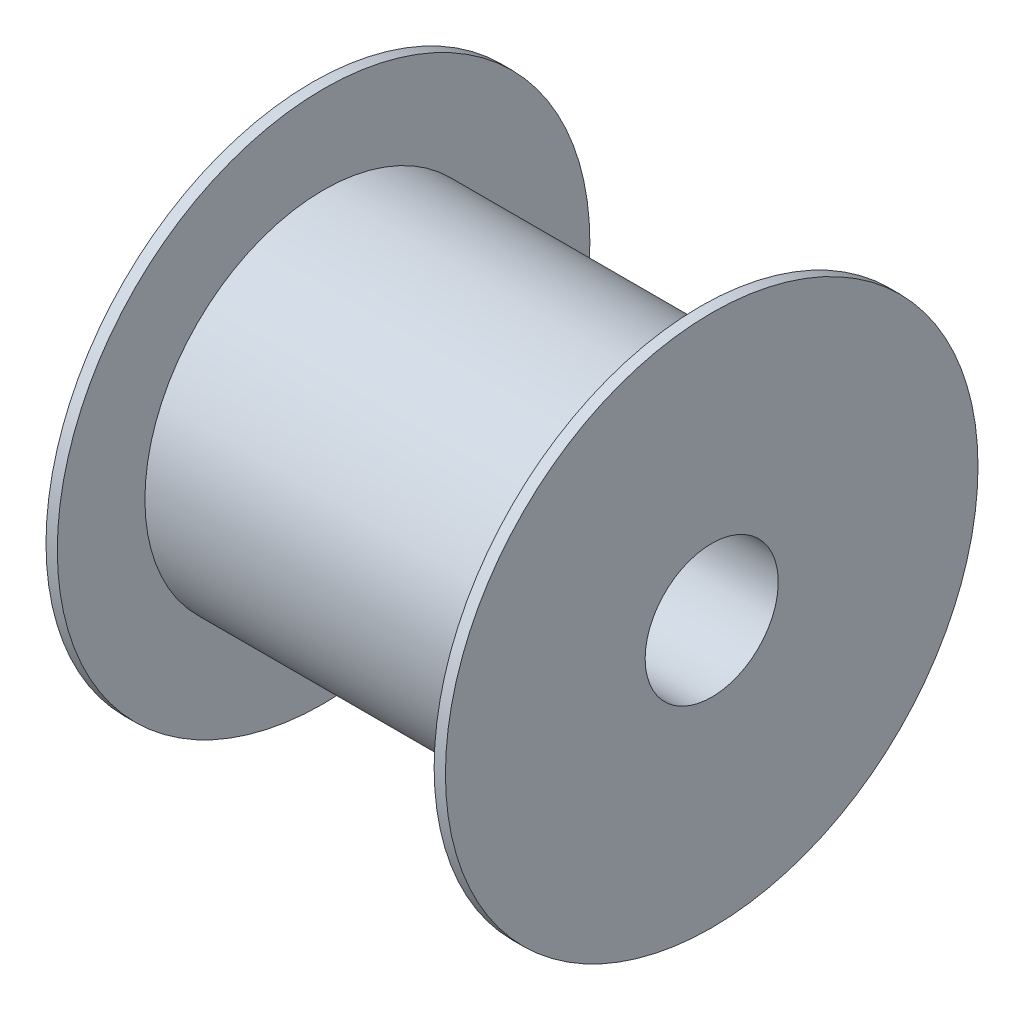
ISO-10303-21;
HEADER;
FILE_DESCRIPTION(('STEP AP214'),'2;1');
FILE_NAME('part.step','',(''),(''),'','','');
FILE_SCHEMA(('AUTOMOTIVE_DESIGN { 1 0 10303 214 1 1 1 1 }'));
ENDSEC;
DATA;
#1=APPLICATION_CONTEXT('core data for automotive mechanical design processes');
#2=APPLICATION_PROTOCOL_DEFINITION('international standard','automotive_design',2000,#1);
#3=PRODUCT_CONTEXT('',#1,'mechanical');
#4=PRODUCT('Part','Part','',(#3));
#5=PRODUCT_RELATED_PRODUCT_CATEGORY('part','',(#4));
#6=PRODUCT_DEFINITION_FORMATION('','',#4);
#7=PRODUCT_DEFINITION_CONTEXT('part definition',#1,'design');
#8=PRODUCT_DEFINITION('design','',#6,#7);
#9=PRODUCT_DEFINITION_SHAPE('','',#8);
#10=(LENGTH_UNIT() NAMED_UNIT(*) SI_UNIT(.MILLI.,.METRE.));
#11=(NAMED_UNIT(*) PLANE_ANGLE_UNIT() SI_UNIT($,.RADIAN.));
#12=(NAMED_UNIT(*) SI_UNIT($,.STERADIAN.) SOLID_ANGLE_UNIT());
#13=UNCERTAINTY_MEASURE_WITH_UNIT(LENGTH_MEASURE(1.E-05),#10,'distance_accuracy_value','');
#14=(GEOMETRIC_REPRESENTATION_CONTEXT(3) GLOBAL_UNCERTAINTY_ASSIGNED_CONTEXT((#13)) GLOBAL_UNIT_ASSIGNED_CONTEXT((#10,
#11,#12)) REPRESENTATION_CONTEXT('',''));
#15=CARTESIAN_POINT('',(0.,0.,0.));
#16=DIRECTION('',(0.,0.,1.));
#17=DIRECTION('',(1.,0.,0.));
#18=AXIS2_PLACEMENT_3D('',#15,#16,#17);
#19=CARTESIAN_POINT('',(28.3028720626632,40.,0.));
#20=DIRECTION('',(1.,0.,0.));
#21=DIRECTION('',(0.,0.,-1.));
#22=AXIS2_PLACEMENT_3D('',#19,#20,#21);
#23=PLANE('',#22);
#24=CARTESIAN_POINT('',(28.3028720626632,0.,0.));
#25=DIRECTION('',(-1.,0.,0.));
#26=DIRECTION('',(0.,0.,1.));
#27=AXIS2_PLACEMENT_3D('',#24,#25,#26);
#28=CIRCLE('',#27,26.8407310704961);
#29=CARTESIAN_POINT('',(28.3028720626632,0.,26.8407310704961));
#30=VERTEX_POINT('',#29);
#31=EDGE_CURVE('E72',#30,#30,#28,.T.);
#32=ORIENTED_EDGE('',*,*,#31,.F.);
#33=EDGE_LOOP('',(#32));
#34=FACE_BOUND('',#33,.T.);
#35=CARTESIAN_POINT('',(28.3028720626632,0.,0.));
#36=DIRECTION('',(-1.,0.,0.));
#37=DIRECTION('',(0.,0.,1.));
#38=AXIS2_PLACEMENT_3D('',#35,#36,#37);
#39=CIRCLE('',#38,40.);
#40=CARTESIAN_POINT('',(28.3028720626632,0.,40.));
#41=VERTEX_POINT('',#40);
#42=EDGE_CURVE('E10',#41,#41,#39,.T.);
#43=ORIENTED_EDGE('',*,*,#42,.T.);
#44=EDGE_LOOP('',(#43));
#45=FACE_BOUND('',#44,.T.);
#46=ADVANCED_FACE('F37',(#34,#45),#23,.F.);
#47=CARTESIAN_POINT('',(0.,0.,0.));
#48=DIRECTION('',(-1.,0.,0.));
#49=DIRECTION('',(0.,0.,1.));
#50=AXIS2_PLACEMENT_3D('',#47,#48,#49);
#51=CYLINDRICAL_SURFACE('',#50,40.);
#52=ORIENTED_EDGE('',*,*,#42,.F.);
#53=EDGE_LOOP('',(#52));
#54=FACE_BOUND('',#53,.T.);
#55=CARTESIAN_POINT('',(30.,0.,0.));
#56=DIRECTION('',(-1.,0.,0.));
#57=DIRECTION('',(0.,0.,1.));
#58=AXIS2_PLACEMENT_3D('',#55,#56,#57);
#59=CIRCLE('',#58,40.);
#60=CARTESIAN_POINT('',(30.,0.,40.));
#61=VERTEX_POINT('',#60);
#62=EDGE_CURVE('E44',#61,#61,#59,.T.);
#63=ORIENTED_EDGE('',*,*,#62,.T.);
#64=EDGE_LOOP('',(#63));
#65=FACE_BOUND('',#64,.T.);
#66=ADVANCED_FACE('F80',(#54,#65),#51,.T.);
#67=CARTESIAN_POINT('',(30.,10.,0.));
#68=DIRECTION('',(-1.,0.,0.));
#69=DIRECTION('',(0.,0.,1.));
#70=AXIS2_PLACEMENT_3D('',#67,#68,#69);
#71=PLANE('',#70);
#72=ORIENTED_EDGE('',*,*,#62,.F.);
#73=EDGE_LOOP('',(#72));
#74=FACE_BOUND('',#73,.T.);
#75=CARTESIAN_POINT('',(30.,0.,0.));
#76=DIRECTION('',(-1.,0.,0.));
#77=DIRECTION('',(0.,0.,1.));
#78=AXIS2_PLACEMENT_3D('',#75,#76,#77);
#79=CIRCLE('',#78,10.);
#80=CARTESIAN_POINT('',(30.,0.,10.));
#81=VERTEX_POINT('',#80);
#82=EDGE_CURVE('E49',#81,#81,#79,.T.);
#83=ORIENTED_EDGE('',*,*,#82,.T.);
#84=EDGE_LOOP('',(#83));
#85=FACE_BOUND('',#84,.T.);
#86=ADVANCED_FACE('F84',(#74,#85),#71,.F.);
#87=CARTESIAN_POINT('',(0.,0.,0.));
#88=DIRECTION('',(-1.,0.,0.));
#89=DIRECTION('',(0.,0.,1.));
#90=AXIS2_PLACEMENT_3D('',#87,#88,#89);
#91=CYLINDRICAL_SURFACE('',#90,10.);
#92=ORIENTED_EDGE('',*,*,#82,.F.);
#93=EDGE_LOOP('',(#92));
#94=FACE_BOUND('',#93,.T.);
#95=CARTESIAN_POINT('',(-30.,0.,0.));
#96=DIRECTION('',(-1.,0.,0.));
#97=DIRECTION('',(0.,0.,1.));
#98=AXIS2_PLACEMENT_3D('',#95,#96,#97);
#99=CIRCLE('',#98,9.99999999999999);
#100=CARTESIAN_POINT('',(-30.,0.,9.99999999999999));
#101=VERTEX_POINT('',#100);
#102=EDGE_CURVE('E54',#101,#101,#99,.T.);
#103=ORIENTED_EDGE('',*,*,#102,.T.);
#104=EDGE_LOOP('',(#103));
#105=FACE_BOUND('',#104,.T.);
#106=ADVANCED_FACE('F89',(#94,#105),#91,.F.);
#107=CARTESIAN_POINT('',(-30.,9.99999999999999,0.));
#108=DIRECTION('',(-1.,0.,0.));
#109=DIRECTION('',(0.,0.,1.));
#110=AXIS2_PLACEMENT_3D('',#107,#108,#109);
#111=PLANE('',#110);
#112=CARTESIAN_POINT('',(-30.,0.,0.));
#113=DIRECTION('',(-1.,0.,0.));
#114=DIRECTION('',(0.,0.,1.));
#115=AXIS2_PLACEMENT_3D('',#112,#113,#114);
#116=CIRCLE('',#115,40.);
#117=CARTESIAN_POINT('',(-30.,0.,40.));
#118=VERTEX_POINT('',#117);
#119=EDGE_CURVE('E60',#118,#118,#116,.T.);
#120=ORIENTED_EDGE('',*,*,#119,.T.);
#121=EDGE_LOOP('',(#120));
#122=FACE_BOUND('',#121,.T.);
#123=ORIENTED_EDGE('',*,*,#102,.F.);
#124=EDGE_LOOP('',(#123));
#125=FACE_BOUND('',#124,.T.);
#126=ADVANCED_FACE('F95',(#122,#125),#111,.T.);
#127=CARTESIAN_POINT('',(0.,0.,0.));
#128=DIRECTION('',(-1.,0.,0.));
#129=DIRECTION('',(0.,0.,1.));
#130=AXIS2_PLACEMENT_3D('',#127,#128,#129);
#131=CYLINDRICAL_SURFACE('',#130,40.);
#132=CARTESIAN_POINT('',(-28.3028720626632,0.,0.));
#133=DIRECTION('',(-1.,0.,0.));
#134=DIRECTION('',(0.,0.,1.));
#135=AXIS2_PLACEMENT_3D('',#132,#133,#134);
#136=CIRCLE('',#135,40.);
#137=CARTESIAN_POINT('',(-28.3028720626632,0.,40.));
#138=VERTEX_POINT('',#137);
#139=EDGE_CURVE('E64',#138,#138,#136,.T.);
#140=ORIENTED_EDGE('',*,*,#139,.T.);
#141=EDGE_LOOP('',(#140));
#142=FACE_BOUND('',#141,.T.);
#143=ORIENTED_EDGE('',*,*,#119,.F.);
#144=EDGE_LOOP('',(#143));
#145=FACE_BOUND('',#144,.T.);
#146=ADVANCED_FACE('F99',(#142,#145),#131,.T.);
#147=CARTESIAN_POINT('',(-28.3028720626632,40.,0.));
#148=DIRECTION('',(1.,0.,0.));
#149=DIRECTION('',(0.,0.,-1.));
#150=AXIS2_PLACEMENT_3D('',#147,#148,#149);
#151=PLANE('',#150);
#152=CARTESIAN_POINT('',(-28.3028720626632,0.,0.));
#153=DIRECTION('',(-1.,0.,0.));
#154=DIRECTION('',(0.,0.,1.));
#155=AXIS2_PLACEMENT_3D('',#152,#153,#154);
#156=CIRCLE('',#155,26.8407310704961);
#157=CARTESIAN_POINT('',(-28.3028720626632,0.,26.8407310704961));
#158=VERTEX_POINT('',#157);
#159=EDGE_CURVE('E68',#158,#158,#156,.T.);
#160=ORIENTED_EDGE('',*,*,#159,.T.);
#161=EDGE_LOOP('',(#160));
#162=FACE_BOUND('',#161,.T.);
#163=ORIENTED_EDGE('',*,*,#139,.F.);
#164=EDGE_LOOP('',(#163));
#165=FACE_BOUND('',#164,.T.);
#166=ADVANCED_FACE('F103',(#162,#165),#151,.T.);
#167=CARTESIAN_POINT('',(0.,0.,0.));
#168=DIRECTION('',(-1.,0.,0.));
#169=DIRECTION('',(0.,0.,1.));
#170=AXIS2_PLACEMENT_3D('',#167,#168,#169);
#171=CYLINDRICAL_SURFACE('',#170,26.8407310704961);
#172=ORIENTED_EDGE('',*,*,#159,.F.);
#173=EDGE_LOOP('',(#172));
#174=FACE_BOUND('',#173,.T.);
#175=ORIENTED_EDGE('',*,*,#31,.T.);
#176=EDGE_LOOP('',(#175));
#177=FACE_BOUND('',#176,.T.);
#178=ADVANCED_FACE('F77',(#174,#177),#171,.T.);
#179=CLOSED_SHELL('',(#46,#66,#86,#106,#126,#146,#166,#178));
#180=MANIFOLD_SOLID_BREP('B2',#179);
#181=ADVANCED_BREP_SHAPE_REPRESENTATION('',(#18,#180),#14);
#182=SHAPE_DEFINITION_REPRESENTATION(#9,#181);
ENDSEC;
END-ISO-10303-21;
